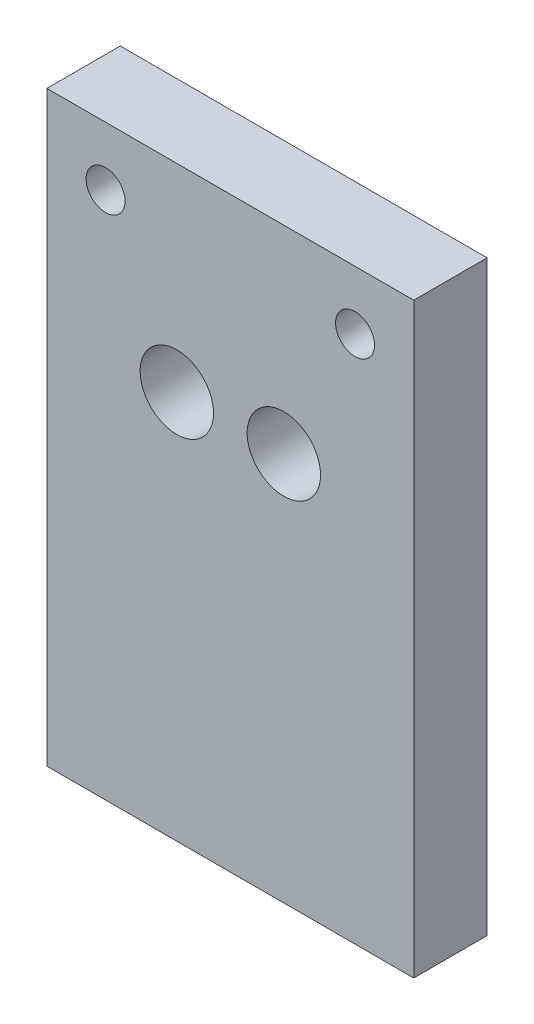
ISO-10303-21;
HEADER;
FILE_DESCRIPTION(('STEP AP214'),'2;1');
FILE_NAME('part.step','',(''),(''),'','','');
FILE_SCHEMA(('AUTOMOTIVE_DESIGN { 1 0 10303 214 1 1 1 1 }'));
ENDSEC;
DATA;
#1=APPLICATION_CONTEXT('core data for automotive mechanical design processes');
#2=APPLICATION_PROTOCOL_DEFINITION('international standard','automotive_design',2000,#1);
#3=PRODUCT_CONTEXT('',#1,'mechanical');
#4=PRODUCT('Part','Part','',(#3));
#5=PRODUCT_RELATED_PRODUCT_CATEGORY('part','',(#4));
#6=PRODUCT_DEFINITION_FORMATION('','',#4);
#7=PRODUCT_DEFINITION_CONTEXT('part definition',#1,'design');
#8=PRODUCT_DEFINITION('design','',#6,#7);
#9=PRODUCT_DEFINITION_SHAPE('','',#8);
#10=(LENGTH_UNIT() NAMED_UNIT(*) SI_UNIT(.MILLI.,.METRE.));
#11=(NAMED_UNIT(*) PLANE_ANGLE_UNIT() SI_UNIT($,.RADIAN.));
#12=(NAMED_UNIT(*) SI_UNIT($,.STERADIAN.) SOLID_ANGLE_UNIT());
#13=UNCERTAINTY_MEASURE_WITH_UNIT(LENGTH_MEASURE(1.E-05),#10,'distance_accuracy_value','');
#14=(GEOMETRIC_REPRESENTATION_CONTEXT(3) GLOBAL_UNCERTAINTY_ASSIGNED_CONTEXT((#13)) GLOBAL_UNIT_ASSIGNED_CONTEXT((#10,
#11,#12)) REPRESENTATION_CONTEXT('',''));
#15=CARTESIAN_POINT('',(0.,0.,0.));
#16=DIRECTION('',(0.,0.,1.));
#17=DIRECTION('',(1.,0.,0.));
#18=AXIS2_PLACEMENT_3D('',#15,#16,#17);
#19=CARTESIAN_POINT('',(0.,0.,12.7));
#20=DIRECTION('',(0.,0.,1.));
#21=DIRECTION('',(1.,0.,0.));
#22=AXIS2_PLACEMENT_3D('',#19,#20,#21);
#23=PLANE('',#22);
#24=CARTESIAN_POINT('',(21.59,24.13,12.7));
#25=DIRECTION('',(0.,0.,1.));
#26=DIRECTION('',(1.,0.,0.));
#27=AXIS2_PLACEMENT_3D('',#24,#25,#26);
#28=CIRCLE('',#27,3.37819999999999);
#29=CARTESIAN_POINT('',(24.9682,24.13,12.7));
#30=VERTEX_POINT('',#29);
#31=EDGE_CURVE('E126',#30,#30,#28,.T.);
#32=ORIENTED_EDGE('',*,*,#31,.F.);
#33=EDGE_LOOP('',(#32));
#34=FACE_BOUND('',#33,.T.);
#35=CARTESIAN_POINT('',(-21.59,24.13,12.7));
#36=DIRECTION('',(0.,0.,1.));
#37=DIRECTION('',(1.,0.,0.));
#38=AXIS2_PLACEMENT_3D('',#35,#36,#37);
#39=CIRCLE('',#38,3.37819999999999);
#40=CARTESIAN_POINT('',(-18.2118,24.13,12.7));
#41=VERTEX_POINT('',#40);
#42=EDGE_CURVE('E120',#41,#41,#39,.T.);
#43=ORIENTED_EDGE('',*,*,#42,.F.);
#44=EDGE_LOOP('',(#43));
#45=FACE_BOUND('',#44,.T.);
#46=DIRECTION('',(1.,0.,0.));
#47=VECTOR('',#46,1.);
#48=CARTESIAN_POINT('',(-31.75,34.29,12.7));
#49=LINE('',#48,#47);
#50=CARTESIAN_POINT('',(-31.75,34.29,12.7));
#51=VERTEX_POINT('',#50);
#52=CARTESIAN_POINT('',(31.75,34.29,12.7));
#53=VERTEX_POINT('',#52);
#54=EDGE_CURVE('E113',#51,#53,#49,.T.);
#55=ORIENTED_EDGE('',*,*,#54,.F.);
#56=DIRECTION('',(0.,-1.,0.));
#57=VECTOR('',#56,1.);
#58=CARTESIAN_POINT('',(-31.75,67.31,12.7));
#59=LINE('',#58,#57);
#60=CARTESIAN_POINT('',(-31.75,-67.31,12.7));
#61=VERTEX_POINT('',#60);
#62=EDGE_CURVE('E98',#51,#61,#59,.T.);
#63=ORIENTED_EDGE('',*,*,#62,.T.);
#64=DIRECTION('',(1.,0.,0.));
#65=VECTOR('',#64,1.);
#66=CARTESIAN_POINT('',(-31.75,-67.31,12.7));
#67=LINE('',#66,#65);
#68=CARTESIAN_POINT('',(31.75,-67.31,12.7));
#69=VERTEX_POINT('',#68);
#70=EDGE_CURVE('E61',#61,#69,#67,.T.);
#71=ORIENTED_EDGE('',*,*,#70,.T.);
#72=DIRECTION('',(0.,1.,0.));
#73=VECTOR('',#72,1.);
#74=CARTESIAN_POINT('',(31.75,67.31,12.7));
#75=LINE('',#74,#73);
#76=EDGE_CURVE('E81',#69,#53,#75,.T.);
#77=ORIENTED_EDGE('',*,*,#76,.T.);
#78=EDGE_LOOP('',(#55,#63,#71,#77));
#79=FACE_BOUND('',#78,.T.);
#80=CARTESIAN_POINT('',(-9.26084,0.,12.7));
#81=DIRECTION('',(0.,0.,1.));
#82=DIRECTION('',(1.,0.,0.));
#83=AXIS2_PLACEMENT_3D('',#80,#81,#82);
#84=CIRCLE('',#83,6.35);
#85=CARTESIAN_POINT('',(-2.91084,0.,12.7));
#86=VERTEX_POINT('',#85);
#87=EDGE_CURVE('E90',#86,#86,#84,.T.);
#88=ORIENTED_EDGE('',*,*,#87,.F.);
#89=EDGE_LOOP('',(#88));
#90=FACE_BOUND('',#89,.T.);
#91=CARTESIAN_POINT('',(9.26084,0.,12.7));
#92=DIRECTION('',(0.,0.,1.));
#93=DIRECTION('',(1.,0.,0.));
#94=AXIS2_PLACEMENT_3D('',#91,#92,#93);
#95=CIRCLE('',#94,6.35);
#96=CARTESIAN_POINT('',(15.61084,0.,12.7));
#97=VERTEX_POINT('',#96);
#98=EDGE_CURVE('E102',#97,#97,#95,.T.);
#99=ORIENTED_EDGE('',*,*,#98,.F.);
#100=EDGE_LOOP('',(#99));
#101=FACE_BOUND('',#100,.T.);
#102=ADVANCED_FACE('F37',(#34,#45,#79,#90,#101),#23,.T.);
#103=CARTESIAN_POINT('',(0.,0.,0.));
#104=DIRECTION('',(0.,0.,1.));
#105=DIRECTION('',(1.,0.,0.));
#106=AXIS2_PLACEMENT_3D('',#103,#104,#105);
#107=PLANE('',#106);
#108=CARTESIAN_POINT('',(21.59,24.13,0.));
#109=DIRECTION('',(0.,0.,1.));
#110=DIRECTION('',(1.,0.,0.));
#111=AXIS2_PLACEMENT_3D('',#108,#109,#110);
#112=CIRCLE('',#111,3.3782);
#113=CARTESIAN_POINT('',(24.9682,24.13,0.));
#114=VERTEX_POINT('',#113);
#115=EDGE_CURVE('E123',#114,#114,#112,.T.);
#116=ORIENTED_EDGE('',*,*,#115,.T.);
#117=EDGE_LOOP('',(#116));
#118=FACE_BOUND('',#117,.T.);
#119=CARTESIAN_POINT('',(-21.59,24.13,0.));
#120=DIRECTION('',(0.,0.,1.));
#121=DIRECTION('',(1.,0.,0.));
#122=AXIS2_PLACEMENT_3D('',#119,#120,#121);
#123=CIRCLE('',#122,3.3782);
#124=CARTESIAN_POINT('',(-18.2118,24.13,0.));
#125=VERTEX_POINT('',#124);
#126=EDGE_CURVE('E116',#125,#125,#123,.T.);
#127=ORIENTED_EDGE('',*,*,#126,.T.);
#128=EDGE_LOOP('',(#127));
#129=FACE_BOUND('',#128,.T.);
#130=DIRECTION('',(0.,-1.,0.));
#131=VECTOR('',#130,1.);
#132=CARTESIAN_POINT('',(-31.75,67.31,0.));
#133=LINE('',#132,#131);
#134=CARTESIAN_POINT('',(-31.75,34.29,0.));
#135=VERTEX_POINT('',#134);
#136=CARTESIAN_POINT('',(-31.75,-67.31,0.));
#137=VERTEX_POINT('',#136);
#138=EDGE_CURVE('E82',#135,#137,#133,.T.);
#139=ORIENTED_EDGE('',*,*,#138,.F.);
#140=DIRECTION('',(1.,0.,0.));
#141=VECTOR('',#140,1.);
#142=CARTESIAN_POINT('',(-31.75,34.29,0.));
#143=LINE('',#142,#141);
#144=CARTESIAN_POINT('',(31.75,34.29,0.));
#145=VERTEX_POINT('',#144);
#146=EDGE_CURVE('E52',#135,#145,#143,.T.);
#147=ORIENTED_EDGE('',*,*,#146,.T.);
#148=DIRECTION('',(0.,1.,0.));
#149=VECTOR('',#148,1.);
#150=CARTESIAN_POINT('',(31.75,67.31,0.));
#151=LINE('',#150,#149);
#152=CARTESIAN_POINT('',(31.75,-67.31,0.));
#153=VERTEX_POINT('',#152);
#154=EDGE_CURVE('E87',#153,#145,#151,.T.);
#155=ORIENTED_EDGE('',*,*,#154,.F.);
#156=DIRECTION('',(1.,0.,0.));
#157=VECTOR('',#156,1.);
#158=CARTESIAN_POINT('',(-31.75,-67.31,0.));
#159=LINE('',#158,#157);
#160=EDGE_CURVE('E73',#137,#153,#159,.T.);
#161=ORIENTED_EDGE('',*,*,#160,.F.);
#162=EDGE_LOOP('',(#139,#147,#155,#161));
#163=FACE_BOUND('',#162,.T.);
#164=CARTESIAN_POINT('',(-9.26084,0.,0.));
#165=DIRECTION('',(0.,0.,1.));
#166=DIRECTION('',(1.,0.,0.));
#167=AXIS2_PLACEMENT_3D('',#164,#165,#166);
#168=CIRCLE('',#167,6.35);
#169=CARTESIAN_POINT('',(-2.91084,0.,0.));
#170=VERTEX_POINT('',#169);
#171=EDGE_CURVE('E94',#170,#170,#168,.T.);
#172=ORIENTED_EDGE('',*,*,#171,.T.);
#173=EDGE_LOOP('',(#172));
#174=FACE_BOUND('',#173,.T.);
#175=CARTESIAN_POINT('',(9.26084,0.,0.));
#176=DIRECTION('',(0.,0.,1.));
#177=DIRECTION('',(1.,0.,0.));
#178=AXIS2_PLACEMENT_3D('',#175,#176,#177);
#179=CIRCLE('',#178,6.35);
#180=CARTESIAN_POINT('',(15.61084,0.,0.));
#181=VERTEX_POINT('',#180);
#182=EDGE_CURVE('E104',#181,#181,#179,.T.);
#183=ORIENTED_EDGE('',*,*,#182,.T.);
#184=EDGE_LOOP('',(#183));
#185=FACE_BOUND('',#184,.T.);
#186=ADVANCED_FACE('F88',(#118,#129,#163,#174,#185),#107,.F.);
#187=CARTESIAN_POINT('',(31.75,67.31,12.7));
#188=DIRECTION('',(-1.,0.,0.));
#189=DIRECTION('',(0.,-1.,0.));
#190=AXIS2_PLACEMENT_3D('',#187,#188,#189);
#191=PLANE('',#190);
#192=ORIENTED_EDGE('',*,*,#154,.T.);
#193=DIRECTION('',(0.,0.,1.));
#194=VECTOR('',#193,1.);
#195=CARTESIAN_POINT('',(31.75,34.29,0.));
#196=LINE('',#195,#194);
#197=EDGE_CURVE('E107',#145,#53,#196,.T.);
#198=ORIENTED_EDGE('',*,*,#197,.T.);
#199=ORIENTED_EDGE('',*,*,#76,.F.);
#200=DIRECTION('',(0.,0.,-1.));
#201=VECTOR('',#200,1.);
#202=CARTESIAN_POINT('',(31.75,-67.31,12.7));
#203=LINE('',#202,#201);
#204=EDGE_CURVE('E45',#69,#153,#203,.T.);
#205=ORIENTED_EDGE('',*,*,#204,.T.);
#206=EDGE_LOOP('',(#192,#198,#199,#205));
#207=FACE_BOUND('',#206,.T.);
#208=ADVANCED_FACE('F39',(#207),#191,.F.);
#209=CARTESIAN_POINT('',(-31.75,67.31,12.7));
#210=DIRECTION('',(1.,0.,0.));
#211=DIRECTION('',(0.,1.,0.));
#212=AXIS2_PLACEMENT_3D('',#209,#210,#211);
#213=PLANE('',#212);
#214=ORIENTED_EDGE('',*,*,#62,.F.);
#215=DIRECTION('',(0.,0.,1.));
#216=VECTOR('',#215,1.);
#217=CARTESIAN_POINT('',(-31.75,34.29,0.));
#218=LINE('',#217,#216);
#219=EDGE_CURVE('E110',#135,#51,#218,.T.);
#220=ORIENTED_EDGE('',*,*,#219,.F.);
#221=ORIENTED_EDGE('',*,*,#138,.T.);
#222=DIRECTION('',(0.,0.,-1.));
#223=VECTOR('',#222,1.);
#224=CARTESIAN_POINT('',(-31.75,-67.31,12.7));
#225=LINE('',#224,#223);
#226=EDGE_CURVE('E11',#61,#137,#225,.T.);
#227=ORIENTED_EDGE('',*,*,#226,.F.);
#228=EDGE_LOOP('',(#214,#220,#221,#227));
#229=FACE_BOUND('',#228,.T.);
#230=ADVANCED_FACE('F147',(#229),#213,.F.);
#231=CARTESIAN_POINT('',(-31.75,-67.31,12.7));
#232=DIRECTION('',(0.,1.,0.));
#233=DIRECTION('',(0.,0.,1.));
#234=AXIS2_PLACEMENT_3D('',#231,#232,#233);
#235=PLANE('',#234);
#236=CARTESIAN_POINT('',(21.59,-67.31,6.35));
#237=DIRECTION('',(0.,-1.,0.));
#238=DIRECTION('',(0.,0.,-1.));
#239=AXIS2_PLACEMENT_3D('',#236,#237,#238);
#240=CIRCLE('',#239,2.0193);
#241=CARTESIAN_POINT('',(21.59,-67.31,4.3307));
#242=VERTEX_POINT('',#241);
#243=EDGE_CURVE('E138',#242,#242,#240,.T.);
#244=ORIENTED_EDGE('',*,*,#243,.F.);
#245=EDGE_LOOP('',(#244));
#246=FACE_BOUND('',#245,.T.);
#247=CARTESIAN_POINT('',(-21.59,-67.31,6.35));
#248=DIRECTION('',(0.,-1.,0.));
#249=DIRECTION('',(0.,0.,-1.));
#250=AXIS2_PLACEMENT_3D('',#247,#248,#249);
#251=CIRCLE('',#250,2.0193);
#252=CARTESIAN_POINT('',(-21.59,-67.31,4.3307));
#253=VERTEX_POINT('',#252);
#254=EDGE_CURVE('E132',#253,#253,#251,.T.);
#255=ORIENTED_EDGE('',*,*,#254,.F.);
#256=EDGE_LOOP('',(#255));
#257=FACE_BOUND('',#256,.T.);
#258=ORIENTED_EDGE('',*,*,#160,.T.);
#259=ORIENTED_EDGE('',*,*,#204,.F.);
#260=ORIENTED_EDGE('',*,*,#70,.F.);
#261=ORIENTED_EDGE('',*,*,#226,.T.);
#262=EDGE_LOOP('',(#258,#259,#260,#261));
#263=FACE_BOUND('',#262,.T.);
#264=ADVANCED_FACE('F75',(#246,#257,#263),#235,.F.);
#265=CARTESIAN_POINT('',(-9.26084,0.,12.7));
#266=DIRECTION('',(0.,0.,-1.));
#267=DIRECTION('',(-1.,0.,0.));
#268=AXIS2_PLACEMENT_3D('',#265,#266,#267);
#269=CYLINDRICAL_SURFACE('',#268,6.35);
#270=ORIENTED_EDGE('',*,*,#87,.T.);
#271=EDGE_LOOP('',(#270));
#272=FACE_BOUND('',#271,.T.);
#273=ORIENTED_EDGE('',*,*,#171,.F.);
#274=EDGE_LOOP('',(#273));
#275=FACE_BOUND('',#274,.T.);
#276=ADVANCED_FACE('F146',(#272,#275),#269,.F.);
#277=CARTESIAN_POINT('',(9.26084,0.,12.7));
#278=DIRECTION('',(0.,0.,-1.));
#279=DIRECTION('',(-1.,0.,0.));
#280=AXIS2_PLACEMENT_3D('',#277,#278,#279);
#281=CYLINDRICAL_SURFACE('',#280,6.35);
#282=ORIENTED_EDGE('',*,*,#98,.T.);
#283=EDGE_LOOP('',(#282));
#284=FACE_BOUND('',#283,.T.);
#285=ORIENTED_EDGE('',*,*,#182,.F.);
#286=EDGE_LOOP('',(#285));
#287=FACE_BOUND('',#286,.T.);
#288=ADVANCED_FACE('F269',(#284,#287),#281,.F.);
#289=CARTESIAN_POINT('',(-31.75,34.29,0.));
#290=DIRECTION('',(0.,-1.,0.));
#291=DIRECTION('',(1.,0.,0.));
#292=AXIS2_PLACEMENT_3D('',#289,#290,#291);
#293=PLANE('',#292);
#294=ORIENTED_EDGE('',*,*,#54,.T.);
#295=ORIENTED_EDGE('',*,*,#197,.F.);
#296=ORIENTED_EDGE('',*,*,#146,.F.);
#297=ORIENTED_EDGE('',*,*,#219,.T.);
#298=EDGE_LOOP('',(#294,#295,#296,#297));
#299=FACE_BOUND('',#298,.T.);
#300=ADVANCED_FACE('F192',(#299),#293,.F.);
#301=CARTESIAN_POINT('',(-21.59,24.13,12.7));
#302=DIRECTION('',(0.,0.,1.));
#303=DIRECTION('',(1.,0.,0.));
#304=AXIS2_PLACEMENT_3D('',#301,#302,#303);
#305=CYLINDRICAL_SURFACE('',#304,3.37819999999999);
#306=ORIENTED_EDGE('',*,*,#126,.F.);
#307=EDGE_LOOP('',(#306));
#308=FACE_BOUND('',#307,.T.);
#309=ORIENTED_EDGE('',*,*,#42,.T.);
#310=EDGE_LOOP('',(#309));
#311=FACE_BOUND('',#310,.T.);
#312=ADVANCED_FACE('F240',(#308,#311),#305,.F.);
#313=CARTESIAN_POINT('',(21.59,24.13,12.7));
#314=DIRECTION('',(0.,0.,1.));
#315=DIRECTION('',(1.,0.,0.));
#316=AXIS2_PLACEMENT_3D('',#313,#314,#315);
#317=CYLINDRICAL_SURFACE('',#316,3.37819999999999);
#318=ORIENTED_EDGE('',*,*,#115,.F.);
#319=EDGE_LOOP('',(#318));
#320=FACE_BOUND('',#319,.T.);
#321=ORIENTED_EDGE('',*,*,#31,.T.);
#322=EDGE_LOOP('',(#321));
#323=FACE_BOUND('',#322,.T.);
#324=ADVANCED_FACE('F163',(#320,#323),#317,.F.);
#325=CARTESIAN_POINT('',(-21.59,-41.91,6.35));
#326=DIRECTION('',(0.,-1.,0.));
#327=DIRECTION('',(0.,0.,-1.));
#328=AXIS2_PLACEMENT_3D('',#325,#326,#327);
#329=CONICAL_SURFACE('',#328,2.01929999999999,1.02974425867665);
#330=CARTESIAN_POINT('',(-21.59,-40.6966821519977,6.35));
#331=VERTEX_POINT('',#330);
#332=VERTEX_LOOP('',#331);
#333=FACE_BOUND('',#332,.T.);
#334=CARTESIAN_POINT('',(-21.59,-41.91,6.35));
#335=DIRECTION('',(0.,-1.,0.));
#336=DIRECTION('',(0.,0.,-1.));
#337=AXIS2_PLACEMENT_3D('',#334,#335,#336);
#338=CIRCLE('',#337,2.01929999999999);
#339=CARTESIAN_POINT('',(-21.59,-41.91,4.3307));
#340=VERTEX_POINT('',#339);
#341=EDGE_CURVE('E129',#340,#340,#338,.T.);
#342=ORIENTED_EDGE('',*,*,#341,.T.);
#343=EDGE_LOOP('',(#342));
#344=FACE_BOUND('',#343,.T.);
#345=ADVANCED_FACE('F154',(#333,#344),#329,.F.);
#346=CARTESIAN_POINT('',(-21.59,-67.31,6.35));
#347=DIRECTION('',(0.,-1.,0.));
#348=DIRECTION('',(0.,0.,-1.));
#349=AXIS2_PLACEMENT_3D('',#346,#347,#348);
#350=CYLINDRICAL_SURFACE('',#349,2.0193);
#351=ORIENTED_EDGE('',*,*,#341,.F.);
#352=EDGE_LOOP('',(#351));
#353=FACE_BOUND('',#352,.T.);
#354=ORIENTED_EDGE('',*,*,#254,.T.);
#355=EDGE_LOOP('',(#354));
#356=FACE_BOUND('',#355,.T.);
#357=ADVANCED_FACE('F151',(#353,#356),#350,.F.);
#358=CARTESIAN_POINT('',(21.59,-41.91,6.35));
#359=DIRECTION('',(0.,-1.,0.));
#360=DIRECTION('',(0.,0.,-1.));
#361=AXIS2_PLACEMENT_3D('',#358,#359,#360);
#362=CONICAL_SURFACE('',#361,2.01929999999999,1.02974425867665);
#363=CARTESIAN_POINT('',(21.59,-40.6966821519977,6.35));
#364=VERTEX_POINT('',#363);
#365=VERTEX_LOOP('',#364);
#366=FACE_BOUND('',#365,.T.);
#367=CARTESIAN_POINT('',(21.59,-41.91,6.35));
#368=DIRECTION('',(0.,-1.,0.));
#369=DIRECTION('',(0.,0.,-1.));
#370=AXIS2_PLACEMENT_3D('',#367,#368,#369);
#371=CIRCLE('',#370,2.01929999999999);
#372=CARTESIAN_POINT('',(21.59,-41.91,4.3307));
#373=VERTEX_POINT('',#372);
#374=EDGE_CURVE('E135',#373,#373,#371,.T.);
#375=ORIENTED_EDGE('',*,*,#374,.T.);
#376=EDGE_LOOP('',(#375));
#377=FACE_BOUND('',#376,.T.);
#378=ADVANCED_FACE('F153',(#366,#377),#362,.F.);
#379=CARTESIAN_POINT('',(21.59,-67.31,6.35));
#380=DIRECTION('',(0.,-1.,0.));
#381=DIRECTION('',(0.,0.,-1.));
#382=AXIS2_PLACEMENT_3D('',#379,#380,#381);
#383=CYLINDRICAL_SURFACE('',#382,2.0193);
#384=ORIENTED_EDGE('',*,*,#374,.F.);
#385=EDGE_LOOP('',(#384));
#386=FACE_BOUND('',#385,.T.);
#387=ORIENTED_EDGE('',*,*,#243,.T.);
#388=EDGE_LOOP('',(#387));
#389=FACE_BOUND('',#388,.T.);
#390=ADVANCED_FACE('F142',(#386,#389),#383,.F.);
#391=CLOSED_SHELL('',(#102,#186,#208,#230,#264,#276,#288,#300,#312,#324,#345,#357,#378,#390));
#392=MANIFOLD_SOLID_BREP('B2',#391);
#393=ADVANCED_BREP_SHAPE_REPRESENTATION('',(#18,#392),#14);
#394=SHAPE_DEFINITION_REPRESENTATION(#9,#393);
ENDSEC;
END-ISO-10303-21;
